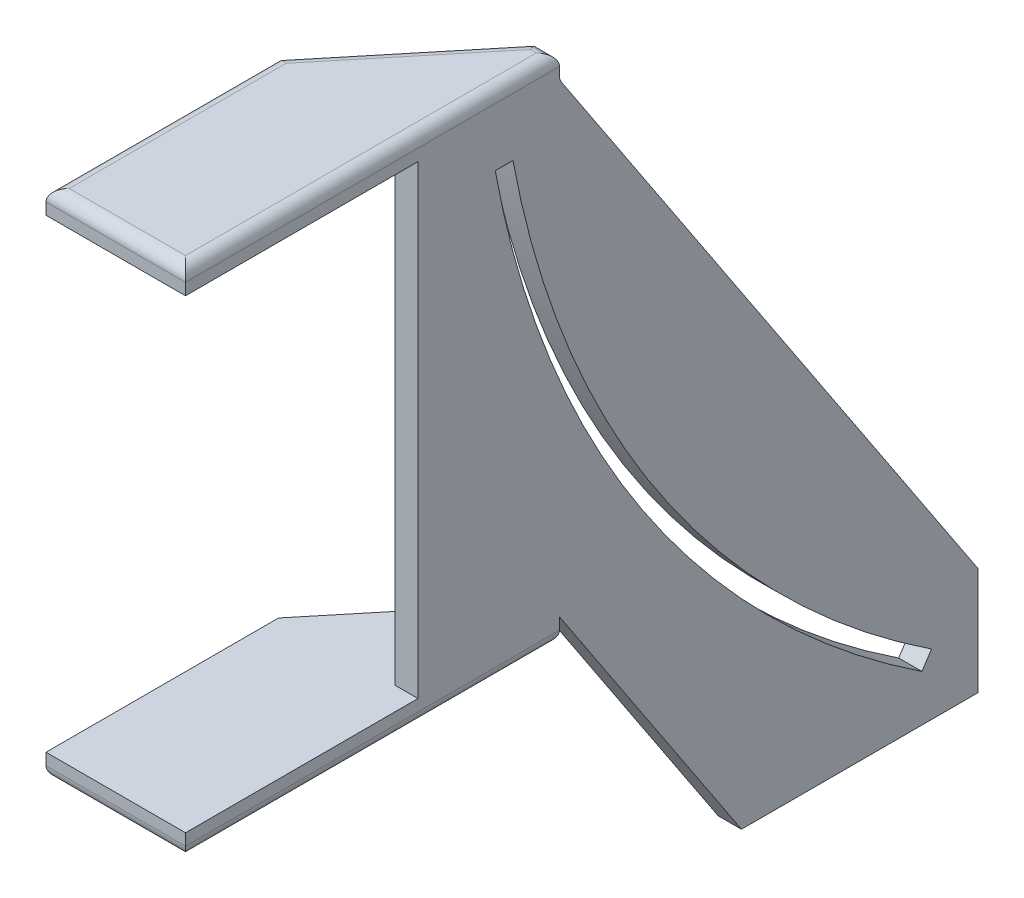
ISO-10303-21;
HEADER;
FILE_DESCRIPTION(('STEP AP214'),'2;1');
FILE_NAME('part.step','',(''),(''),'','','');
FILE_SCHEMA(('AUTOMOTIVE_DESIGN { 1 0 10303 214 1 1 1 1 }'));
ENDSEC;
DATA;
#1=APPLICATION_CONTEXT('core data for automotive mechanical design processes');
#2=APPLICATION_PROTOCOL_DEFINITION('international standard','automotive_design',2000,#1);
#3=PRODUCT_CONTEXT('',#1,'mechanical');
#4=PRODUCT('Part','Part','',(#3));
#5=PRODUCT_RELATED_PRODUCT_CATEGORY('part','',(#4));
#6=PRODUCT_DEFINITION_FORMATION('','',#4);
#7=PRODUCT_DEFINITION_CONTEXT('part definition',#1,'design');
#8=PRODUCT_DEFINITION('design','',#6,#7);
#9=PRODUCT_DEFINITION_SHAPE('','',#8);
#10=(LENGTH_UNIT() NAMED_UNIT(*) SI_UNIT(.MILLI.,.METRE.));
#11=(NAMED_UNIT(*) PLANE_ANGLE_UNIT() SI_UNIT($,.RADIAN.));
#12=(NAMED_UNIT(*) SI_UNIT($,.STERADIAN.) SOLID_ANGLE_UNIT());
#13=UNCERTAINTY_MEASURE_WITH_UNIT(LENGTH_MEASURE(1.E-05),#10,'distance_accuracy_value','');
#14=(GEOMETRIC_REPRESENTATION_CONTEXT(3) GLOBAL_UNCERTAINTY_ASSIGNED_CONTEXT((#13)) GLOBAL_UNIT_ASSIGNED_CONTEXT((#10,
#11,#12)) REPRESENTATION_CONTEXT('',''));
#15=CARTESIAN_POINT('',(0.,0.,0.));
#16=DIRECTION('',(0.,0.,1.));
#17=DIRECTION('',(1.,0.,0.));
#18=AXIS2_PLACEMENT_3D('',#15,#16,#17);
#19=CARTESIAN_POINT('',(3.175,0.,0.));
#20=DIRECTION('',(1.,0.,0.));
#21=DIRECTION('',(0.,0.,-1.));
#22=AXIS2_PLACEMENT_3D('',#19,#20,#21);
#23=PLANE('',#22);
#24=DIRECTION('',(0.,1.,0.));
#25=VECTOR('',#24,1.);
#26=CARTESIAN_POINT('',(3.17499999999999,-84.201,174.625));
#27=LINE('',#26,#25);
#28=CARTESIAN_POINT('',(3.17499999999999,-82.6135,174.625));
#29=VERTEX_POINT('',#28);
#30=CARTESIAN_POINT('',(3.17499999999999,-81.026,174.625));
#31=VERTEX_POINT('',#30);
#32=EDGE_CURVE('E209',#29,#31,#27,.T.);
#33=ORIENTED_EDGE('',*,*,#32,.F.);
#34=DIRECTION('',(0.,0.,1.));
#35=VECTOR('',#34,1.);
#36=CARTESIAN_POINT('',(3.175,-82.6135,0.));
#37=LINE('',#36,#35);
#38=CARTESIAN_POINT('',(3.175,-82.6135,123.554053146928));
#39=VERTEX_POINT('',#38);
#40=EDGE_CURVE('E41',#29,#39,#37,.F.);
#41=ORIENTED_EDGE('',*,*,#40,.T.);
#42=DIRECTION('',(0.,1.,0.));
#43=VECTOR('',#42,1.);
#44=CARTESIAN_POINT('',(3.175,-84.201,123.554053146928));
#45=LINE('',#44,#43);
#46=CARTESIAN_POINT('',(3.175,-81.026,123.554053146928));
#47=VERTEX_POINT('',#46);
#48=EDGE_CURVE('E200',#39,#47,#45,.T.);
#49=ORIENTED_EDGE('',*,*,#48,.T.);
#50=DIRECTION('',(0.,-0.833932185113221,-0.55186693199746));
#51=VECTOR('',#50,1.);
#52=CARTESIAN_POINT('',(3.175,-81.026,123.554053146928));
#53=LINE('',#52,#51);
#54=CARTESIAN_POINT('',(3.175,-118.573420749169,98.7064932815561));
#55=VERTEX_POINT('',#54);
#56=EDGE_CURVE('E204',#47,#55,#53,.T.);
#57=ORIENTED_EDGE('',*,*,#56,.T.);
#58=DIRECTION('',(0.,0.,-1.));
#59=VECTOR('',#58,1.);
#60=CARTESIAN_POINT('',(3.175,-118.573420749169,98.7064932815561));
#61=LINE('',#60,#59);
#62=CARTESIAN_POINT('',(3.175,-118.573420749169,66.4040531469284));
#63=VERTEX_POINT('',#62);
#64=EDGE_CURVE('E225',#55,#63,#61,.T.);
#65=ORIENTED_EDGE('',*,*,#64,.T.);
#66=DIRECTION('',(0.,1.,0.));
#67=VECTOR('',#66,1.);
#68=CARTESIAN_POINT('',(3.175,-103.885992990919,66.4040531469284));
#69=LINE('',#68,#67);
#70=CARTESIAN_POINT('',(3.175,-103.885992990919,66.4040531469284));
#71=VERTEX_POINT('',#70);
#72=EDGE_CURVE('E228',#63,#71,#69,.T.);
#73=ORIENTED_EDGE('',*,*,#72,.T.);
#74=DIRECTION('',(0.,0.833932185113221,0.55186693199746));
#75=VECTOR('',#74,1.);
#76=CARTESIAN_POINT('',(3.175,-17.526,123.554053146928));
#77=LINE('',#76,#75);
#78=CARTESIAN_POINT('',(3.175,-17.9243782036011,123.290420490796));
#79=VERTEX_POINT('',#78);
#80=EDGE_CURVE('E236',#71,#79,#77,.T.);
#81=ORIENTED_EDGE('',*,*,#80,.T.);
#82=CARTESIAN_POINT('',(3.175,-17.0482894490551,121.966553146928));
#83=DIRECTION('',(1.,0.,0.));
#84=DIRECTION('',(0.,0.,-1.));
#85=AXIS2_PLACEMENT_3D('',#82,#83,#84);
#86=CIRCLE('',#85,1.5875);
#87=CARTESIAN_POINT('',(3.175,-17.0482894490551,123.554053146928));
#88=VERTEX_POINT('',#87);
#89=EDGE_CURVE('E296',#79,#88,#86,.F.);
#90=ORIENTED_EDGE('',*,*,#89,.T.);
#91=DIRECTION('',(0.,-1.,0.));
#92=VECTOR('',#91,1.);
#93=CARTESIAN_POINT('',(3.175,-14.351,123.554053146928));
#94=LINE('',#93,#92);
#95=CARTESIAN_POINT('',(3.175,-15.9385,123.554053146928));
#96=VERTEX_POINT('',#95);
#97=EDGE_CURVE('E381',#96,#88,#94,.T.);
#98=ORIENTED_EDGE('',*,*,#97,.F.);
#99=DIRECTION('',(0.,0.,-1.));
#100=VECTOR('',#99,1.);
#101=CARTESIAN_POINT('',(3.175,-15.9385,174.625));
#102=LINE('',#101,#100);
#103=CARTESIAN_POINT('',(3.17499999999999,-15.9385,174.625));
#104=VERTEX_POINT('',#103);
#105=EDGE_CURVE('E284',#96,#104,#102,.F.);
#106=ORIENTED_EDGE('',*,*,#105,.T.);
#107=DIRECTION('',(0.,-1.,0.));
#108=VECTOR('',#107,1.);
#109=CARTESIAN_POINT('',(3.17499999999999,-14.351,174.625));
#110=LINE('',#109,#108);
#111=CARTESIAN_POINT('',(3.17499999999999,-17.526,174.625));
#112=VERTEX_POINT('',#111);
#113=EDGE_CURVE('E384',#104,#112,#110,.T.);
#114=ORIENTED_EDGE('',*,*,#113,.T.);
#115=DIRECTION('',(0.,0.,-1.));
#116=VECTOR('',#115,1.);
#117=CARTESIAN_POINT('',(3.175,-17.526,123.554053146928));
#118=LINE('',#117,#116);
#119=CARTESIAN_POINT('',(3.175,-17.526,142.875));
#120=VERTEX_POINT('',#119);
#121=EDGE_CURVE('E375',#112,#120,#118,.T.);
#122=ORIENTED_EDGE('',*,*,#121,.T.);
#123=DIRECTION('',(0.,-1.,0.));
#124=VECTOR('',#123,1.);
#125=CARTESIAN_POINT('',(3.175,-17.526,142.875));
#126=LINE('',#125,#124);
#127=CARTESIAN_POINT('',(3.175,-81.026,142.875));
#128=VERTEX_POINT('',#127);
#129=EDGE_CURVE('E226',#120,#128,#126,.T.);
#130=ORIENTED_EDGE('',*,*,#129,.T.);
#131=DIRECTION('',(0.,0.,1.));
#132=VECTOR('',#131,1.);
#133=CARTESIAN_POINT('',(3.175,-81.026,123.554053146928));
#134=LINE('',#133,#132);
#135=EDGE_CURVE('E345',#128,#31,#134,.T.);
#136=ORIENTED_EDGE('',*,*,#135,.T.);
#137=EDGE_LOOP('',(#33,#41,#49,#57,#65,#73,#81,#90,#98,#106,#114,#122,#130,#136));
#138=FACE_BOUND('',#137,.T.);
#139=DIRECTION('',(0.,0.,1.));
#140=VECTOR('',#139,1.);
#141=CARTESIAN_POINT('',(3.175,-23.876,132.324466277263));
#142=LINE('',#141,#140);
#143=CARTESIAN_POINT('',(3.175,-23.876,129.904053146928));
#144=VERTEX_POINT('',#143);
#145=CARTESIAN_POINT('',(3.175,-23.876,132.324466277263));
#146=VERTEX_POINT('',#145);
#147=EDGE_CURVE('E393',#144,#146,#142,.T.);
#148=ORIENTED_EDGE('',*,*,#147,.F.);
#149=CARTESIAN_POINT('',(3.175,0.,0.));
#150=DIRECTION('',(-1.,0.,0.));
#151=DIRECTION('',(0.,0.,-1.));
#152=AXIS2_PLACEMENT_3D('',#149,#150,#151);
#153=CIRCLE('',#152,132.08);
#154=CARTESIAN_POINT('',(3.175,-110.235992990919,72.7540531469284));
#155=VERTEX_POINT('',#154);
#156=EDGE_CURVE('E391',#155,#144,#153,.T.);
#157=ORIENTED_EDGE('',*,*,#156,.F.);
#158=DIRECTION('',(0.,0.834615331548452,-0.550833230973102));
#159=VECTOR('',#158,1.);
#160=CARTESIAN_POINT('',(3.175,-112.223420749169,74.0657247781831));
#161=LINE('',#160,#159);
#162=CARTESIAN_POINT('',(3.175,-112.223420749169,74.0657247781831));
#163=VERTEX_POINT('',#162);
#164=EDGE_CURVE('E399',#163,#155,#161,.T.);
#165=ORIENTED_EDGE('',*,*,#164,.F.);
#166=CARTESIAN_POINT('',(3.175,0.,0.));
#167=DIRECTION('',(1.,0.,0.));
#168=DIRECTION('',(0.,0.,-1.));
#169=AXIS2_PLACEMENT_3D('',#166,#167,#168);
#170=CIRCLE('',#169,134.46125);
#171=EDGE_CURVE('E396',#146,#163,#170,.T.);
#172=ORIENTED_EDGE('',*,*,#171,.F.);
#173=EDGE_LOOP('',(#148,#157,#165,#172));
#174=FACE_BOUND('',#173,.T.);
#175=ADVANCED_FACE('F32',(#138,#174),#23,.T.);
#176=CARTESIAN_POINT('',(0.,0.,0.));
#177=DIRECTION('',(1.,0.,0.));
#178=DIRECTION('',(0.,0.,-1.));
#179=AXIS2_PLACEMENT_3D('',#176,#177,#178);
#180=PLANE('',#179);
#181=DIRECTION('',(0.,-1.,0.));
#182=VECTOR('',#181,1.);
#183=CARTESIAN_POINT('',(0.,-17.526,142.875));
#184=LINE('',#183,#182);
#185=CARTESIAN_POINT('',(0.,-17.526,142.875));
#186=VERTEX_POINT('',#185);
#187=CARTESIAN_POINT('',(0.,-81.026,142.875));
#188=VERTEX_POINT('',#187);
#189=EDGE_CURVE('E240',#186,#188,#184,.T.);
#190=ORIENTED_EDGE('',*,*,#189,.F.);
#191=DIRECTION('',(0.,0.,1.));
#192=VECTOR('',#191,1.);
#193=CARTESIAN_POINT('',(0.,-17.526,142.875));
#194=LINE('',#193,#192);
#195=CARTESIAN_POINT('',(0.,-17.526,123.554053146928));
#196=VERTEX_POINT('',#195);
#197=EDGE_CURVE('E231',#196,#186,#194,.T.);
#198=ORIENTED_EDGE('',*,*,#197,.F.);
#199=DIRECTION('',(0.,1.,0.));
#200=VECTOR('',#199,1.);
#201=CARTESIAN_POINT('',(0.,-14.351,123.554053146928));
#202=LINE('',#201,#200);
#203=CARTESIAN_POINT('',(0.,-17.0482929876395,123.554053146928));
#204=VERTEX_POINT('',#203);
#205=EDGE_CURVE('E298',#196,#204,#202,.T.);
#206=ORIENTED_EDGE('',*,*,#205,.T.);
#207=CARTESIAN_POINT('',(0.,-17.0482894490551,121.966553146928));
#208=DIRECTION('',(1.,0.,0.));
#209=DIRECTION('',(0.,0.,-1.));
#210=AXIS2_PLACEMENT_3D('',#207,#208,#209);
#211=CIRCLE('',#210,1.5875);
#212=CARTESIAN_POINT('',(0.,-17.9243782036011,123.290420490796));
#213=VERTEX_POINT('',#212);
#214=EDGE_CURVE('E294',#204,#213,#211,.T.);
#215=ORIENTED_EDGE('',*,*,#214,.T.);
#216=DIRECTION('',(0.,0.833932185113221,0.55186693199746));
#217=VECTOR('',#216,1.);
#218=CARTESIAN_POINT('',(0.,-17.526,123.554053146928));
#219=LINE('',#218,#217);
#220=CARTESIAN_POINT('',(0.,-103.885992990919,66.4040531469284));
#221=VERTEX_POINT('',#220);
#222=EDGE_CURVE('E253',#221,#213,#219,.T.);
#223=ORIENTED_EDGE('',*,*,#222,.F.);
#224=DIRECTION('',(0.,1.,0.));
#225=VECTOR('',#224,1.);
#226=CARTESIAN_POINT('',(0.,-103.885992990919,66.4040531469284));
#227=LINE('',#226,#225);
#228=CARTESIAN_POINT('',(0.,-118.573420749169,66.4040531469284));
#229=VERTEX_POINT('',#228);
#230=EDGE_CURVE('E251',#229,#221,#227,.T.);
#231=ORIENTED_EDGE('',*,*,#230,.F.);
#232=DIRECTION('',(0.,0.,-1.));
#233=VECTOR('',#232,1.);
#234=CARTESIAN_POINT('',(0.,-118.573420749169,98.7064932815561));
#235=LINE('',#234,#233);
#236=CARTESIAN_POINT('',(0.,-118.573420749169,98.7064932815561));
#237=VERTEX_POINT('',#236);
#238=EDGE_CURVE('E249',#237,#229,#235,.T.);
#239=ORIENTED_EDGE('',*,*,#238,.F.);
#240=DIRECTION('',(0.,-0.833932185113221,-0.55186693199746));
#241=VECTOR('',#240,1.);
#242=CARTESIAN_POINT('',(0.,-81.026,123.554053146928));
#243=LINE('',#242,#241);
#244=CARTESIAN_POINT('',(0.,-81.026,123.554053146928));
#245=VERTEX_POINT('',#244);
#246=EDGE_CURVE('E247',#245,#237,#243,.T.);
#247=ORIENTED_EDGE('',*,*,#246,.F.);
#248=DIRECTION('',(0.,0.,-1.));
#249=VECTOR('',#248,1.);
#250=CARTESIAN_POINT('',(0.,-81.026,142.875));
#251=LINE('',#250,#249);
#252=EDGE_CURVE('E243',#188,#245,#251,.T.);
#253=ORIENTED_EDGE('',*,*,#252,.F.);
#254=EDGE_LOOP('',(#190,#198,#206,#215,#223,#231,#239,#247,#253));
#255=FACE_BOUND('',#254,.T.);
#256=CARTESIAN_POINT('',(0.,0.,0.));
#257=DIRECTION('',(-1.,0.,0.));
#258=DIRECTION('',(0.,0.,-1.));
#259=AXIS2_PLACEMENT_3D('',#256,#257,#258);
#260=CIRCLE('',#259,132.08);
#261=CARTESIAN_POINT('',(0.,-110.235992990919,72.7540531469284));
#262=VERTEX_POINT('',#261);
#263=CARTESIAN_POINT('',(0.,-23.876,129.904053146928));
#264=VERTEX_POINT('',#263);
#265=EDGE_CURVE('E390',#262,#264,#260,.T.);
#266=ORIENTED_EDGE('',*,*,#265,.T.);
#267=DIRECTION('',(0.,0.,1.));
#268=VECTOR('',#267,1.);
#269=CARTESIAN_POINT('',(0.,-23.876,132.324466277263));
#270=LINE('',#269,#268);
#271=CARTESIAN_POINT('',(0.,-23.876,132.324466277263));
#272=VERTEX_POINT('',#271);
#273=EDGE_CURVE('E404',#264,#272,#270,.T.);
#274=ORIENTED_EDGE('',*,*,#273,.T.);
#275=CARTESIAN_POINT('',(0.,0.,0.));
#276=DIRECTION('',(1.,0.,0.));
#277=DIRECTION('',(0.,0.,-1.));
#278=AXIS2_PLACEMENT_3D('',#275,#276,#277);
#279=CIRCLE('',#278,134.46125);
#280=CARTESIAN_POINT('',(0.,-112.223420749169,74.0657247781831));
#281=VERTEX_POINT('',#280);
#282=EDGE_CURVE('E407',#272,#281,#279,.T.);
#283=ORIENTED_EDGE('',*,*,#282,.T.);
#284=DIRECTION('',(0.,0.834615331548452,-0.550833230973102));
#285=VECTOR('',#284,1.);
#286=CARTESIAN_POINT('',(0.,-112.223420749169,74.0657247781831));
#287=LINE('',#286,#285);
#288=EDGE_CURVE('E394',#281,#262,#287,.T.);
#289=ORIENTED_EDGE('',*,*,#288,.T.);
#290=EDGE_LOOP('',(#266,#274,#283,#289));
#291=FACE_BOUND('',#290,.T.);
#292=ADVANCED_FACE('F426',(#255,#291),#180,.F.);
#293=CARTESIAN_POINT('',(3.175,-17.526,142.875));
#294=DIRECTION('',(0.,0.,-1.));
#295=DIRECTION('',(-1.,0.,0.));
#296=AXIS2_PLACEMENT_3D('',#293,#294,#295);
#297=PLANE('',#296);
#298=ORIENTED_EDGE('',*,*,#189,.T.);
#299=DIRECTION('',(-1.,0.,0.));
#300=VECTOR('',#299,1.);
#301=CARTESIAN_POINT('',(3.175,-81.026,142.875));
#302=LINE('',#301,#300);
#303=EDGE_CURVE('E219',#128,#188,#302,.T.);
#304=ORIENTED_EDGE('',*,*,#303,.F.);
#305=ORIENTED_EDGE('',*,*,#129,.F.);
#306=DIRECTION('',(-1.,0.,0.));
#307=VECTOR('',#306,1.);
#308=CARTESIAN_POINT('',(3.175,-17.526,142.875));
#309=LINE('',#308,#307);
#310=EDGE_CURVE('E239',#120,#186,#309,.T.);
#311=ORIENTED_EDGE('',*,*,#310,.T.);
#312=EDGE_LOOP('',(#298,#304,#305,#311));
#313=FACE_BOUND('',#312,.T.);
#314=ADVANCED_FACE('F451',(#313),#297,.F.);
#315=CARTESIAN_POINT('',(3.175,-81.026,123.554053146928));
#316=DIRECTION('',(0.,0.55186693199746,-0.833932185113221));
#317=DIRECTION('',(0.,0.833932185113221,0.55186693199746));
#318=AXIS2_PLACEMENT_3D('',#315,#316,#317);
#319=PLANE('',#318);
#320=ORIENTED_EDGE('',*,*,#246,.T.);
#321=DIRECTION('',(-1.,0.,0.));
#322=VECTOR('',#321,1.);
#323=CARTESIAN_POINT('',(3.175,-118.573420749169,98.7064932815561));
#324=LINE('',#323,#322);
#325=EDGE_CURVE('E220',#55,#237,#324,.T.);
#326=ORIENTED_EDGE('',*,*,#325,.F.);
#327=ORIENTED_EDGE('',*,*,#56,.F.);
#328=DIRECTION('',(-1.,0.,0.));
#329=VECTOR('',#328,1.);
#330=CARTESIAN_POINT('',(3.175,-81.026,123.554053146928));
#331=LINE('',#330,#329);
#332=EDGE_CURVE('E212',#47,#245,#331,.T.);
#333=ORIENTED_EDGE('',*,*,#332,.T.);
#334=EDGE_LOOP('',(#320,#326,#327,#333));
#335=FACE_BOUND('',#334,.T.);
#336=ADVANCED_FACE('F222',(#335),#319,.F.);
#337=CARTESIAN_POINT('',(3.175,-118.573420749169,98.7064932815561));
#338=DIRECTION('',(0.,1.,0.));
#339=DIRECTION('',(0.,0.,1.));
#340=AXIS2_PLACEMENT_3D('',#337,#338,#339);
#341=PLANE('',#340);
#342=ORIENTED_EDGE('',*,*,#238,.T.);
#343=DIRECTION('',(-1.,0.,0.));
#344=VECTOR('',#343,1.);
#345=CARTESIAN_POINT('',(3.175,-118.573420749169,66.4040531469284));
#346=LINE('',#345,#344);
#347=EDGE_CURVE('E262',#63,#229,#346,.T.);
#348=ORIENTED_EDGE('',*,*,#347,.F.);
#349=ORIENTED_EDGE('',*,*,#64,.F.);
#350=ORIENTED_EDGE('',*,*,#325,.T.);
#351=EDGE_LOOP('',(#342,#348,#349,#350));
#352=FACE_BOUND('',#351,.T.);
#353=ADVANCED_FACE('F463',(#352),#341,.F.);
#354=CARTESIAN_POINT('',(3.175,-103.885992990919,66.4040531469284));
#355=DIRECTION('',(0.,0.,1.));
#356=DIRECTION('',(1.,0.,0.));
#357=AXIS2_PLACEMENT_3D('',#354,#355,#356);
#358=PLANE('',#357);
#359=ORIENTED_EDGE('',*,*,#230,.T.);
#360=DIRECTION('',(-1.,0.,0.));
#361=VECTOR('',#360,1.);
#362=CARTESIAN_POINT('',(3.175,-103.885992990919,66.4040531469284));
#363=LINE('',#362,#361);
#364=EDGE_CURVE('E259',#71,#221,#363,.T.);
#365=ORIENTED_EDGE('',*,*,#364,.F.);
#366=ORIENTED_EDGE('',*,*,#72,.F.);
#367=ORIENTED_EDGE('',*,*,#347,.T.);
#368=EDGE_LOOP('',(#359,#365,#366,#367));
#369=FACE_BOUND('',#368,.T.);
#370=ADVANCED_FACE('F459',(#369),#358,.F.);
#371=CARTESIAN_POINT('',(3.175,-17.526,123.554053146928));
#372=DIRECTION('',(0.,-0.55186693199746,0.83393218511322));
#373=DIRECTION('',(0.,-0.833932185113221,-0.55186693199746));
#374=AXIS2_PLACEMENT_3D('',#371,#372,#373);
#375=PLANE('',#374);
#376=ORIENTED_EDGE('',*,*,#222,.T.);
#377=DIRECTION('',(-1.,0.,0.));
#378=VECTOR('',#377,1.);
#379=CARTESIAN_POINT('',(3.175,-17.9243782036011,123.290420490796));
#380=LINE('',#379,#378);
#381=EDGE_CURVE('E292',#213,#79,#380,.F.);
#382=ORIENTED_EDGE('',*,*,#381,.T.);
#383=ORIENTED_EDGE('',*,*,#80,.F.);
#384=ORIENTED_EDGE('',*,*,#364,.T.);
#385=EDGE_LOOP('',(#376,#382,#383,#384));
#386=FACE_BOUND('',#385,.T.);
#387=ADVANCED_FACE('F456',(#386),#375,.F.);
#388=CARTESIAN_POINT('',(3.175,0.,0.));
#389=DIRECTION('',(-1.,0.,0.));
#390=DIRECTION('',(0.,0.,1.));
#391=AXIS2_PLACEMENT_3D('',#388,#389,#390);
#392=CYLINDRICAL_SURFACE('',#391,132.08);
#393=ORIENTED_EDGE('',*,*,#265,.F.);
#394=DIRECTION('',(-1.,0.,0.));
#395=VECTOR('',#394,1.);
#396=CARTESIAN_POINT('',(3.175,-110.235992990919,72.7540531469284));
#397=LINE('',#396,#395);
#398=EDGE_CURVE('E401',#155,#262,#397,.T.);
#399=ORIENTED_EDGE('',*,*,#398,.F.);
#400=ORIENTED_EDGE('',*,*,#156,.T.);
#401=DIRECTION('',(-1.,0.,0.));
#402=VECTOR('',#401,1.);
#403=CARTESIAN_POINT('',(3.175,-23.876,129.904053146928));
#404=LINE('',#403,#402);
#405=EDGE_CURVE('E244',#144,#264,#404,.T.);
#406=ORIENTED_EDGE('',*,*,#405,.T.);
#407=EDGE_LOOP('',(#393,#399,#400,#406));
#408=FACE_BOUND('',#407,.T.);
#409=ADVANCED_FACE('F420',(#408),#392,.T.);
#410=CARTESIAN_POINT('',(3.175,-23.876,132.324466277263));
#411=DIRECTION('',(0.,-1.,0.));
#412=DIRECTION('',(0.,0.,-1.));
#413=AXIS2_PLACEMENT_3D('',#410,#411,#412);
#414=PLANE('',#413);
#415=ORIENTED_EDGE('',*,*,#273,.F.);
#416=ORIENTED_EDGE('',*,*,#405,.F.);
#417=ORIENTED_EDGE('',*,*,#147,.T.);
#418=DIRECTION('',(-1.,0.,0.));
#419=VECTOR('',#418,1.);
#420=CARTESIAN_POINT('',(3.175,-23.876,132.324466277263));
#421=LINE('',#420,#419);
#422=EDGE_CURVE('E416',#146,#272,#421,.T.);
#423=ORIENTED_EDGE('',*,*,#422,.T.);
#424=EDGE_LOOP('',(#415,#416,#417,#423));
#425=FACE_BOUND('',#424,.T.);
#426=ADVANCED_FACE('F434',(#425),#414,.T.);
#427=CARTESIAN_POINT('',(3.175,0.,0.));
#428=DIRECTION('',(-1.,0.,0.));
#429=DIRECTION('',(0.,0.,1.));
#430=AXIS2_PLACEMENT_3D('',#427,#428,#429);
#431=CYLINDRICAL_SURFACE('',#430,134.46125);
#432=ORIENTED_EDGE('',*,*,#282,.F.);
#433=ORIENTED_EDGE('',*,*,#422,.F.);
#434=ORIENTED_EDGE('',*,*,#171,.T.);
#435=DIRECTION('',(-1.,0.,0.));
#436=VECTOR('',#435,1.);
#437=CARTESIAN_POINT('',(3.175,-112.223420749169,74.0657247781831));
#438=LINE('',#437,#436);
#439=EDGE_CURVE('E414',#163,#281,#438,.T.);
#440=ORIENTED_EDGE('',*,*,#439,.T.);
#441=EDGE_LOOP('',(#432,#433,#434,#440));
#442=FACE_BOUND('',#441,.T.);
#443=ADVANCED_FACE('F436',(#442),#431,.F.);
#444=CARTESIAN_POINT('',(3.175,-112.223420749169,74.0657247781831));
#445=DIRECTION('',(0.,0.550833230973102,0.834615331548452));
#446=DIRECTION('',(0.,-0.834615331548452,0.550833230973102));
#447=AXIS2_PLACEMENT_3D('',#444,#445,#446);
#448=PLANE('',#447);
#449=ORIENTED_EDGE('',*,*,#288,.F.);
#450=ORIENTED_EDGE('',*,*,#439,.F.);
#451=ORIENTED_EDGE('',*,*,#164,.T.);
#452=ORIENTED_EDGE('',*,*,#398,.T.);
#453=EDGE_LOOP('',(#449,#450,#451,#452));
#454=FACE_BOUND('',#453,.T.);
#455=ADVANCED_FACE('F430',(#454),#448,.T.);
#456=CARTESIAN_POINT('',(0.,-14.351,123.554053146928));
#457=DIRECTION('',(0.772643432088012,0.,0.634840237265454));
#458=DIRECTION('',(0.634840237265454,0.,-0.772643432088012));
#459=AXIS2_PLACEMENT_3D('',#456,#457,#458);
#460=PLANE('',#459);
#461=DIRECTION('',(0.,-1.,0.));
#462=VECTOR('',#461,1.);
#463=CARTESIAN_POINT('',(-15.875,-14.351,142.875));
#464=LINE('',#463,#462);
#465=CARTESIAN_POINT('',(-15.875,-15.9385,142.875));
#466=VERTEX_POINT('',#465);
#467=CARTESIAN_POINT('',(-15.875,-17.526,142.875));
#468=VERTEX_POINT('',#467);
#469=EDGE_CURVE('E388',#466,#468,#464,.T.);
#470=ORIENTED_EDGE('',*,*,#469,.F.);
#471=DIRECTION('',(-0.634840237265454,0.,0.772643432088012));
#472=VECTOR('',#471,1.);
#473=CARTESIAN_POINT('',(0.,-15.9385,123.554053146928));
#474=LINE('',#473,#472);
#475=CARTESIAN_POINT('',(0.,-15.9385,123.554053146928));
#476=VERTEX_POINT('',#475);
#477=EDGE_CURVE('E290',#466,#476,#474,.F.);
#478=ORIENTED_EDGE('',*,*,#477,.T.);
#479=DIRECTION('',(0.,-1.,0.));
#480=VECTOR('',#479,1.);
#481=CARTESIAN_POINT('',(0.,-14.351,123.554053146928));
#482=LINE('',#481,#480);
#483=EDGE_CURVE('E378',#476,#204,#482,.T.);
#484=ORIENTED_EDGE('',*,*,#483,.T.);
#485=ORIENTED_EDGE('',*,*,#205,.F.);
#486=DIRECTION('',(-0.634840237265454,0.,0.772643432088012));
#487=VECTOR('',#486,1.);
#488=CARTESIAN_POINT('',(0.,-17.526,123.554053146928));
#489=LINE('',#488,#487);
#490=EDGE_CURVE('E314',#196,#468,#489,.T.);
#491=ORIENTED_EDGE('',*,*,#490,.T.);
#492=EDGE_LOOP('',(#470,#478,#484,#485,#491));
#493=FACE_BOUND('',#492,.T.);
#494=ADVANCED_FACE('F443',(#493),#460,.F.);
#495=CARTESIAN_POINT('',(-15.875,-14.351,142.875));
#496=DIRECTION('',(1.,0.,0.));
#497=DIRECTION('',(0.,0.,-1.));
#498=AXIS2_PLACEMENT_3D('',#495,#496,#497);
#499=PLANE('',#498);
#500=DIRECTION('',(0.,-1.,0.));
#501=VECTOR('',#500,1.);
#502=CARTESIAN_POINT('',(-15.875,-14.351,174.625));
#503=LINE('',#502,#501);
#504=CARTESIAN_POINT('',(-15.875,-15.9385,174.625));
#505=VERTEX_POINT('',#504);
#506=CARTESIAN_POINT('',(-15.875,-17.526,174.625));
#507=VERTEX_POINT('',#506);
#508=EDGE_CURVE('E386',#505,#507,#503,.T.);
#509=ORIENTED_EDGE('',*,*,#508,.F.);
#510=DIRECTION('',(0.,0.,1.));
#511=VECTOR('',#510,1.);
#512=CARTESIAN_POINT('',(-15.875,-15.9385,142.875));
#513=LINE('',#512,#511);
#514=EDGE_CURVE('E288',#505,#466,#513,.F.);
#515=ORIENTED_EDGE('',*,*,#514,.T.);
#516=ORIENTED_EDGE('',*,*,#469,.T.);
#517=DIRECTION('',(0.,0.,1.));
#518=VECTOR('',#517,1.);
#519=CARTESIAN_POINT('',(-15.875,-17.526,142.875));
#520=LINE('',#519,#518);
#521=EDGE_CURVE('E369',#468,#507,#520,.T.);
#522=ORIENTED_EDGE('',*,*,#521,.T.);
#523=EDGE_LOOP('',(#509,#515,#516,#522));
#524=FACE_BOUND('',#523,.T.);
#525=ADVANCED_FACE('F585',(#524),#499,.F.);
#526=CARTESIAN_POINT('',(3.17499999999999,-14.351,174.625));
#527=DIRECTION('',(0.,0.,-1.));
#528=DIRECTION('',(-1.,0.,0.));
#529=AXIS2_PLACEMENT_3D('',#526,#527,#528);
#530=PLANE('',#529);
#531=ORIENTED_EDGE('',*,*,#113,.F.);
#532=DIRECTION('',(1.,0.,0.));
#533=VECTOR('',#532,1.);
#534=CARTESIAN_POINT('',(3.17499999999999,-15.9385,174.625));
#535=LINE('',#534,#533);
#536=EDGE_CURVE('E286',#104,#505,#535,.F.);
#537=ORIENTED_EDGE('',*,*,#536,.T.);
#538=ORIENTED_EDGE('',*,*,#508,.T.);
#539=DIRECTION('',(1.,0.,0.));
#540=VECTOR('',#539,1.);
#541=CARTESIAN_POINT('',(3.17499999999999,-17.526,174.625));
#542=LINE('',#541,#540);
#543=EDGE_CURVE('E372',#507,#112,#542,.T.);
#544=ORIENTED_EDGE('',*,*,#543,.T.);
#545=EDGE_LOOP('',(#531,#537,#538,#544));
#546=FACE_BOUND('',#545,.T.);
#547=ADVANCED_FACE('F552',(#546),#530,.F.);
#548=CARTESIAN_POINT('',(0.,-14.351,123.554053146928));
#549=DIRECTION('',(0.,0.,1.));
#550=DIRECTION('',(1.,0.,0.));
#551=AXIS2_PLACEMENT_3D('',#548,#549,#550);
#552=PLANE('',#551);
#553=ORIENTED_EDGE('',*,*,#483,.F.);
#554=DIRECTION('',(-1.,0.,0.));
#555=VECTOR('',#554,1.);
#556=CARTESIAN_POINT('',(0.,-15.9385,123.554053146928));
#557=LINE('',#556,#555);
#558=EDGE_CURVE('E281',#476,#96,#557,.F.);
#559=ORIENTED_EDGE('',*,*,#558,.T.);
#560=ORIENTED_EDGE('',*,*,#97,.T.);
#561=DIRECTION('',(-1.,0.,0.));
#562=VECTOR('',#561,1.);
#563=CARTESIAN_POINT('',(0.,-17.0482894490551,123.554053146928));
#564=LINE('',#563,#562);
#565=EDGE_CURVE('E278',#88,#204,#564,.T.);
#566=ORIENTED_EDGE('',*,*,#565,.T.);
#567=EDGE_LOOP('',(#553,#559,#560,#566));
#568=FACE_BOUND('',#567,.T.);
#569=ADVANCED_FACE('F563',(#568),#552,.F.);
#570=CARTESIAN_POINT('',(0.,-14.351,0.));
#571=DIRECTION('',(0.,-1.,0.));
#572=DIRECTION('',(0.,0.,-1.));
#573=AXIS2_PLACEMENT_3D('',#570,#571,#572);
#574=PLANE('',#573);
#575=DIRECTION('',(0.,0.,-1.));
#576=VECTOR('',#575,1.);
#577=CARTESIAN_POINT('',(1.5875,-14.351,123.554053146928));
#578=LINE('',#577,#576);
#579=CARTESIAN_POINT('',(1.5875,-14.351,173.0375));
#580=VERTEX_POINT('',#579);
#581=CARTESIAN_POINT('',(1.5875,-14.351,125.141553146928));
#582=VERTEX_POINT('',#581);
#583=EDGE_CURVE('E273',#580,#582,#578,.T.);
#584=ORIENTED_EDGE('',*,*,#583,.T.);
#585=DIRECTION('',(-1.,0.,0.));
#586=VECTOR('',#585,1.);
#587=CARTESIAN_POINT('',(0.,-14.351,125.141553146928));
#588=LINE('',#587,#586);
#589=CARTESIAN_POINT('',(0.75026991658305,-14.351,125.141553146928));
#590=VERTEX_POINT('',#589);
#591=EDGE_CURVE('E275',#582,#590,#588,.T.);
#592=ORIENTED_EDGE('',*,*,#591,.T.);
#593=DIRECTION('',(-0.634840237265454,0.,0.772643432088012));
#594=VECTOR('',#593,1.);
#595=CARTESIAN_POINT('',(61.8304695537487,-14.351,50.8028261570273));
#596=LINE('',#595,#594);
#597=CARTESIAN_POINT('',(-14.2875,-14.351,143.443534460127));
#598=VERTEX_POINT('',#597);
#599=EDGE_CURVE('E267',#590,#598,#596,.T.);
#600=ORIENTED_EDGE('',*,*,#599,.T.);
#601=DIRECTION('',(0.,0.,1.));
#602=VECTOR('',#601,1.);
#603=CARTESIAN_POINT('',(-14.2875,-14.351,0.));
#604=LINE('',#603,#602);
#605=CARTESIAN_POINT('',(-14.2875,-14.351,173.0375));
#606=VERTEX_POINT('',#605);
#607=EDGE_CURVE('E269',#598,#606,#604,.T.);
#608=ORIENTED_EDGE('',*,*,#607,.T.);
#609=DIRECTION('',(1.,0.,0.));
#610=VECTOR('',#609,1.);
#611=CARTESIAN_POINT('',(0.,-14.351,173.0375));
#612=LINE('',#611,#610);
#613=EDGE_CURVE('E271',#606,#580,#612,.T.);
#614=ORIENTED_EDGE('',*,*,#613,.T.);
#615=EDGE_LOOP('',(#584,#592,#600,#608,#614));
#616=FACE_BOUND('',#615,.T.);
#617=ADVANCED_FACE('F579',(#616),#574,.F.);
#618=CARTESIAN_POINT('',(0.,-17.526,0.));
#619=DIRECTION('',(0.,-1.,0.));
#620=DIRECTION('',(0.,0.,-1.));
#621=AXIS2_PLACEMENT_3D('',#618,#619,#620);
#622=PLANE('',#621);
#623=ORIENTED_EDGE('',*,*,#490,.F.);
#624=ORIENTED_EDGE('',*,*,#197,.T.);
#625=ORIENTED_EDGE('',*,*,#310,.F.);
#626=ORIENTED_EDGE('',*,*,#121,.F.);
#627=ORIENTED_EDGE('',*,*,#543,.F.);
#628=ORIENTED_EDGE('',*,*,#521,.F.);
#629=EDGE_LOOP('',(#623,#624,#625,#626,#627,#628));
#630=FACE_BOUND('',#629,.T.);
#631=ADVANCED_FACE('F493',(#630),#622,.T.);
#632=CARTESIAN_POINT('',(0.,-15.9385,173.0375));
#633=DIRECTION('',(1.,0.,0.));
#634=DIRECTION('',(0.,0.,-1.));
#635=AXIS2_PLACEMENT_3D('',#632,#633,#634);
#636=CYLINDRICAL_SURFACE('',#635,1.5875);
#637=CARTESIAN_POINT('',(1.5875,-15.9385,173.0375));
#638=DIRECTION('',(0.707106781186547,0.,-0.707106781186547));
#639=DIRECTION('',(0.707106781186547,0.,0.707106781186547));
#640=AXIS2_PLACEMENT_3D('',#637,#638,#639);
#641=ELLIPSE('',#640,2.24506403026729,1.5875);
#642=EDGE_CURVE('E308',#580,#104,#641,.T.);
#643=ORIENTED_EDGE('',*,*,#642,.F.);
#644=ORIENTED_EDGE('',*,*,#613,.F.);
#645=CARTESIAN_POINT('',(-14.2875,-15.9385,173.0375));
#646=DIRECTION('',(0.707106781186547,0.,0.707106781186548));
#647=DIRECTION('',(-0.707106781186547,0.,0.707106781186547));
#648=AXIS2_PLACEMENT_3D('',#645,#646,#647);
#649=ELLIPSE('',#648,2.24506403026729,1.5875);
#650=EDGE_CURVE('E311',#505,#606,#649,.F.);
#651=ORIENTED_EDGE('',*,*,#650,.F.);
#652=ORIENTED_EDGE('',*,*,#536,.F.);
#653=EDGE_LOOP('',(#643,#644,#651,#652));
#654=FACE_BOUND('',#653,.T.);
#655=ADVANCED_FACE('F489',(#654),#636,.T.);
#656=CARTESIAN_POINT('',(-14.2875,-15.9385,0.));
#657=DIRECTION('',(0.,0.,1.));
#658=DIRECTION('',(1.,0.,0.));
#659=AXIS2_PLACEMENT_3D('',#656,#657,#658);
#660=CYLINDRICAL_SURFACE('',#659,1.5875);
#661=ORIENTED_EDGE('',*,*,#650,.T.);
#662=ORIENTED_EDGE('',*,*,#607,.F.);
#663=CARTESIAN_POINT('',(-14.2875,-15.9385,143.443534460127));
#664=DIRECTION('',(-0.337162103380546,0.,0.941446608174891));
#665=DIRECTION('',(-0.941446608174891,0.,-0.337162103380546));
#666=AXIS2_PLACEMENT_3D('',#663,#664,#665);
#667=ELLIPSE('',#666,1.68623476489821,1.5875);
#668=EDGE_CURVE('E305',#466,#598,#667,.F.);
#669=ORIENTED_EDGE('',*,*,#668,.F.);
#670=ORIENTED_EDGE('',*,*,#514,.F.);
#671=EDGE_LOOP('',(#661,#662,#669,#670));
#672=FACE_BOUND('',#671,.T.);
#673=ADVANCED_FACE('F485',(#672),#660,.T.);
#674=CARTESIAN_POINT('',(1.5875,-15.9385,0.));
#675=DIRECTION('',(0.,0.,1.));
#676=DIRECTION('',(1.,0.,0.));
#677=AXIS2_PLACEMENT_3D('',#674,#675,#676);
#678=CYLINDRICAL_SURFACE('',#677,1.5875);
#679=ORIENTED_EDGE('',*,*,#642,.T.);
#680=ORIENTED_EDGE('',*,*,#105,.F.);
#681=CARTESIAN_POINT('',(1.5875,-15.9385,125.141553146928));
#682=DIRECTION('',(0.707106781186547,0.,0.707106781186547));
#683=DIRECTION('',(-0.707106781186547,0.,0.707106781186547));
#684=AXIS2_PLACEMENT_3D('',#681,#682,#683);
#685=ELLIPSE('',#684,2.24506403026729,1.5875);
#686=EDGE_CURVE('E303',#582,#96,#685,.F.);
#687=ORIENTED_EDGE('',*,*,#686,.F.);
#688=ORIENTED_EDGE('',*,*,#583,.F.);
#689=EDGE_LOOP('',(#679,#680,#687,#688));
#690=FACE_BOUND('',#689,.T.);
#691=ADVANCED_FACE('F481',(#690),#678,.T.);
#692=CARTESIAN_POINT('',(61.8304695537487,-15.9385,50.8028261570273));
#693=DIRECTION('',(-0.634840237265454,0.,0.772643432088012));
#694=DIRECTION('',(0.772643432088012,0.,0.634840237265454));
#695=AXIS2_PLACEMENT_3D('',#692,#693,#694);
#696=CYLINDRICAL_SURFACE('',#695,1.5875);
#697=ORIENTED_EDGE('',*,*,#668,.T.);
#698=ORIENTED_EDGE('',*,*,#599,.F.);
#699=CARTESIAN_POINT('',(0.750269916583036,-15.9385,125.141553146928));
#700=DIRECTION('',(-0.904112890425044,0.,0.427293671106036));
#701=DIRECTION('',(0.427293671106036,0.,0.904112890425044));
#702=AXIS2_PLACEMENT_3D('',#699,#700,#701);
#703=ELLIPSE('',#702,1.75586480052694,1.5875);
#704=EDGE_CURVE('E208',#476,#590,#703,.F.);
#705=ORIENTED_EDGE('',*,*,#704,.F.);
#706=ORIENTED_EDGE('',*,*,#477,.F.);
#707=EDGE_LOOP('',(#697,#698,#705,#706));
#708=FACE_BOUND('',#707,.T.);
#709=ADVANCED_FACE('F477',(#708),#696,.T.);
#710=CARTESIAN_POINT('',(0.,-15.9385,125.141553146928));
#711=DIRECTION('',(-1.,0.,0.));
#712=DIRECTION('',(0.,0.,1.));
#713=AXIS2_PLACEMENT_3D('',#710,#711,#712);
#714=CYLINDRICAL_SURFACE('',#713,1.5875);
#715=ORIENTED_EDGE('',*,*,#686,.T.);
#716=ORIENTED_EDGE('',*,*,#558,.F.);
#717=ORIENTED_EDGE('',*,*,#704,.T.);
#718=ORIENTED_EDGE('',*,*,#591,.F.);
#719=EDGE_LOOP('',(#715,#716,#717,#718));
#720=FACE_BOUND('',#719,.T.);
#721=ADVANCED_FACE('F473',(#720),#714,.T.);
#722=CARTESIAN_POINT('',(0.,-17.0482894490551,121.966553146928));
#723=DIRECTION('',(1.,0.,0.));
#724=DIRECTION('',(0.,0.,-1.));
#725=AXIS2_PLACEMENT_3D('',#722,#723,#724);
#726=CYLINDRICAL_SURFACE('',#725,1.5875);
#727=ORIENTED_EDGE('',*,*,#89,.F.);
#728=ORIENTED_EDGE('',*,*,#381,.F.);
#729=ORIENTED_EDGE('',*,*,#214,.F.);
#730=ORIENTED_EDGE('',*,*,#565,.F.);
#731=EDGE_LOOP('',(#727,#728,#729,#730));
#732=FACE_BOUND('',#731,.T.);
#733=ADVANCED_FACE('F476',(#732),#726,.F.);
#734=CARTESIAN_POINT('',(0.,-81.026,0.));
#735=DIRECTION('',(0.,-1.,0.));
#736=DIRECTION('',(0.,0.,-1.));
#737=AXIS2_PLACEMENT_3D('',#734,#735,#736);
#738=PLANE('',#737);
#739=ORIENTED_EDGE('',*,*,#303,.T.);
#740=ORIENTED_EDGE('',*,*,#252,.T.);
#741=DIRECTION('',(0.634840237265454,0.,-0.772643432088012));
#742=VECTOR('',#741,1.);
#743=CARTESIAN_POINT('',(-15.875,-81.026,142.875));
#744=LINE('',#743,#742);
#745=CARTESIAN_POINT('',(-15.875,-81.026,142.875));
#746=VERTEX_POINT('',#745);
#747=EDGE_CURVE('E359',#746,#245,#744,.T.);
#748=ORIENTED_EDGE('',*,*,#747,.F.);
#749=DIRECTION('',(0.,0.,-1.));
#750=VECTOR('',#749,1.);
#751=CARTESIAN_POINT('',(-15.875,-81.026,174.625));
#752=LINE('',#751,#750);
#753=CARTESIAN_POINT('',(-15.875,-81.026,174.625));
#754=VERTEX_POINT('',#753);
#755=EDGE_CURVE('E354',#754,#746,#752,.T.);
#756=ORIENTED_EDGE('',*,*,#755,.F.);
#757=DIRECTION('',(-1.,0.,0.));
#758=VECTOR('',#757,1.);
#759=CARTESIAN_POINT('',(3.17499999999999,-81.026,174.625));
#760=LINE('',#759,#758);
#761=EDGE_CURVE('E350',#31,#754,#760,.T.);
#762=ORIENTED_EDGE('',*,*,#761,.F.);
#763=ORIENTED_EDGE('',*,*,#135,.F.);
#764=EDGE_LOOP('',(#739,#740,#748,#756,#762,#763));
#765=FACE_BOUND('',#764,.T.);
#766=ADVANCED_FACE('F497',(#765),#738,.F.);
#767=CARTESIAN_POINT('',(0.,-84.201,123.554053146928));
#768=DIRECTION('',(0.,0.,1.));
#769=DIRECTION('',(1.,0.,0.));
#770=AXIS2_PLACEMENT_3D('',#767,#768,#769);
#771=PLANE('',#770);
#772=ORIENTED_EDGE('',*,*,#48,.F.);
#773=DIRECTION('',(1.,0.,0.));
#774=VECTOR('',#773,1.);
#775=CARTESIAN_POINT('',(0.,-82.6135,123.554053146928));
#776=LINE('',#775,#774);
#777=CARTESIAN_POINT('',(0.,-82.6135,123.554053146928));
#778=VERTEX_POINT('',#777);
#779=EDGE_CURVE('E11',#39,#778,#776,.F.);
#780=ORIENTED_EDGE('',*,*,#779,.T.);
#781=DIRECTION('',(0.,1.,0.));
#782=VECTOR('',#781,1.);
#783=CARTESIAN_POINT('',(0.,-84.201,123.554053146928));
#784=LINE('',#783,#782);
#785=EDGE_CURVE('E215',#778,#245,#784,.T.);
#786=ORIENTED_EDGE('',*,*,#785,.T.);
#787=ORIENTED_EDGE('',*,*,#332,.F.);
#788=EDGE_LOOP('',(#772,#780,#786,#787));
#789=FACE_BOUND('',#788,.T.);
#790=ADVANCED_FACE('F213',(#789),#771,.F.);
#791=CARTESIAN_POINT('',(3.17499999999999,-84.201,174.625));
#792=DIRECTION('',(0.,0.,-1.));
#793=DIRECTION('',(-1.,0.,0.));
#794=AXIS2_PLACEMENT_3D('',#791,#792,#793);
#795=PLANE('',#794);
#796=DIRECTION('',(0.,1.,0.));
#797=VECTOR('',#796,1.);
#798=CARTESIAN_POINT('',(-15.875,-84.201,174.625));
#799=LINE('',#798,#797);
#800=CARTESIAN_POINT('',(-15.875,-82.6135,174.625));
#801=VERTEX_POINT('',#800);
#802=EDGE_CURVE('E364',#801,#754,#799,.T.);
#803=ORIENTED_EDGE('',*,*,#802,.F.);
#804=DIRECTION('',(-1.,0.,0.));
#805=VECTOR('',#804,1.);
#806=CARTESIAN_POINT('',(3.17499999999999,-82.6135,174.625));
#807=LINE('',#806,#805);
#808=EDGE_CURVE('E56',#801,#29,#807,.F.);
#809=ORIENTED_EDGE('',*,*,#808,.T.);
#810=ORIENTED_EDGE('',*,*,#32,.T.);
#811=ORIENTED_EDGE('',*,*,#761,.T.);
#812=EDGE_LOOP('',(#803,#809,#810,#811));
#813=FACE_BOUND('',#812,.T.);
#814=ADVANCED_FACE('F534',(#813),#795,.F.);
#815=CARTESIAN_POINT('',(-15.875,-84.201,174.625));
#816=DIRECTION('',(1.,0.,0.));
#817=DIRECTION('',(0.,0.,-1.));
#818=AXIS2_PLACEMENT_3D('',#815,#816,#817);
#819=PLANE('',#818);
#820=DIRECTION('',(0.,1.,0.));
#821=VECTOR('',#820,1.);
#822=CARTESIAN_POINT('',(-15.875,-84.201,142.875));
#823=LINE('',#822,#821);
#824=CARTESIAN_POINT('',(-15.875,-82.6135,142.875));
#825=VERTEX_POINT('',#824);
#826=EDGE_CURVE('E362',#825,#746,#823,.T.);
#827=ORIENTED_EDGE('',*,*,#826,.F.);
#828=DIRECTION('',(0.,0.,-1.));
#829=VECTOR('',#828,1.);
#830=CARTESIAN_POINT('',(-15.875,-82.6135,174.625));
#831=LINE('',#830,#829);
#832=EDGE_CURVE('E328',#825,#801,#831,.F.);
#833=ORIENTED_EDGE('',*,*,#832,.T.);
#834=ORIENTED_EDGE('',*,*,#802,.T.);
#835=ORIENTED_EDGE('',*,*,#755,.T.);
#836=EDGE_LOOP('',(#827,#833,#834,#835));
#837=FACE_BOUND('',#836,.T.);
#838=ADVANCED_FACE('F533',(#837),#819,.F.);
#839=CARTESIAN_POINT('',(-15.875,-84.201,142.875));
#840=DIRECTION('',(0.772643432088012,0.,0.634840237265454));
#841=DIRECTION('',(0.634840237265454,0.,-0.772643432088012));
#842=AXIS2_PLACEMENT_3D('',#839,#840,#841);
#843=PLANE('',#842);
#844=ORIENTED_EDGE('',*,*,#785,.F.);
#845=DIRECTION('',(0.634840237265454,0.,-0.772643432088012));
#846=VECTOR('',#845,1.);
#847=CARTESIAN_POINT('',(-15.875,-82.6135,142.875));
#848=LINE('',#847,#846);
#849=EDGE_CURVE('E325',#778,#825,#848,.F.);
#850=ORIENTED_EDGE('',*,*,#849,.T.);
#851=ORIENTED_EDGE('',*,*,#826,.T.);
#852=ORIENTED_EDGE('',*,*,#747,.T.);
#853=EDGE_LOOP('',(#844,#850,#851,#852));
#854=FACE_BOUND('',#853,.T.);
#855=ADVANCED_FACE('F519',(#854),#843,.F.);
#856=CARTESIAN_POINT('',(0.,-84.201,0.));
#857=DIRECTION('',(0.,-1.,0.));
#858=DIRECTION('',(0.,0.,-1.));
#859=AXIS2_PLACEMENT_3D('',#856,#857,#858);
#860=PLANE('',#859);
#861=DIRECTION('',(0.,0.,-1.));
#862=VECTOR('',#861,1.);
#863=CARTESIAN_POINT('',(-14.2875,-84.201,142.875));
#864=LINE('',#863,#862);
#865=CARTESIAN_POINT('',(-14.2875,-84.201,173.0375));
#866=VERTEX_POINT('',#865);
#867=CARTESIAN_POINT('',(-14.2875,-84.201,143.443534460127));
#868=VERTEX_POINT('',#867);
#869=EDGE_CURVE('E320',#866,#868,#864,.T.);
#870=ORIENTED_EDGE('',*,*,#869,.T.);
#871=DIRECTION('',(0.634840237265454,0.,-0.772643432088012));
#872=VECTOR('',#871,1.);
#873=CARTESIAN_POINT('',(1.22657144843973,-84.201,124.561862023587));
#874=LINE('',#873,#872);
#875=CARTESIAN_POINT('',(0.750269916583044,-84.201,125.141553146928));
#876=VERTEX_POINT('',#875);
#877=EDGE_CURVE('E322',#868,#876,#874,.T.);
#878=ORIENTED_EDGE('',*,*,#877,.T.);
#879=DIRECTION('',(1.,0.,0.));
#880=VECTOR('',#879,1.);
#881=CARTESIAN_POINT('',(3.175,-84.201,125.141553146928));
#882=LINE('',#881,#880);
#883=CARTESIAN_POINT('',(1.5875,-84.201,125.141553146928));
#884=VERTEX_POINT('',#883);
#885=EDGE_CURVE('E301',#876,#884,#882,.T.);
#886=ORIENTED_EDGE('',*,*,#885,.T.);
#887=DIRECTION('',(0.,0.,1.));
#888=VECTOR('',#887,1.);
#889=CARTESIAN_POINT('',(1.5875,-84.201,0.));
#890=LINE('',#889,#888);
#891=CARTESIAN_POINT('',(1.5875,-84.201,173.0375));
#892=VERTEX_POINT('',#891);
#893=EDGE_CURVE('E316',#884,#892,#890,.T.);
#894=ORIENTED_EDGE('',*,*,#893,.T.);
#895=DIRECTION('',(-1.,0.,0.));
#896=VECTOR('',#895,1.);
#897=CARTESIAN_POINT('',(-15.875,-84.201,173.0375));
#898=LINE('',#897,#896);
#899=EDGE_CURVE('E318',#892,#866,#898,.T.);
#900=ORIENTED_EDGE('',*,*,#899,.T.);
#901=EDGE_LOOP('',(#870,#878,#886,#894,#900));
#902=FACE_BOUND('',#901,.T.);
#903=ADVANCED_FACE('F514',(#902),#860,.T.);
#904=CARTESIAN_POINT('',(0.,-82.6135,173.0375));
#905=DIRECTION('',(1.,0.,0.));
#906=DIRECTION('',(0.,0.,-1.));
#907=AXIS2_PLACEMENT_3D('',#904,#905,#906);
#908=CYLINDRICAL_SURFACE('',#907,1.5875);
#909=CARTESIAN_POINT('',(-14.2875,-82.6135,173.0375));
#910=DIRECTION('',(0.707106781186547,0.,0.707106781186548));
#911=DIRECTION('',(0.707106781186547,0.,-0.707106781186547));
#912=AXIS2_PLACEMENT_3D('',#909,#910,#911);
#913=ELLIPSE('',#912,2.24506403026729,1.5875);
#914=EDGE_CURVE('E338',#866,#801,#913,.F.);
#915=ORIENTED_EDGE('',*,*,#914,.F.);
#916=ORIENTED_EDGE('',*,*,#899,.F.);
#917=CARTESIAN_POINT('',(1.5875,-82.6135,173.0375));
#918=DIRECTION('',(-0.707106781186547,0.,0.707106781186547));
#919=DIRECTION('',(0.707106781186547,0.,0.707106781186547));
#920=AXIS2_PLACEMENT_3D('',#917,#918,#919);
#921=ELLIPSE('',#920,2.24506403026729,1.5875);
#922=EDGE_CURVE('E36',#29,#892,#921,.F.);
#923=ORIENTED_EDGE('',*,*,#922,.F.);
#924=ORIENTED_EDGE('',*,*,#808,.F.);
#925=EDGE_LOOP('',(#915,#916,#923,#924));
#926=FACE_BOUND('',#925,.T.);
#927=ADVANCED_FACE('F34',(#926),#908,.T.);
#928=CARTESIAN_POINT('',(1.5875,-82.6135,0.));
#929=DIRECTION('',(0.,0.,1.));
#930=DIRECTION('',(1.,0.,0.));
#931=AXIS2_PLACEMENT_3D('',#928,#929,#930);
#932=CYLINDRICAL_SURFACE('',#931,1.5875);
#933=ORIENTED_EDGE('',*,*,#922,.T.);
#934=ORIENTED_EDGE('',*,*,#893,.F.);
#935=CARTESIAN_POINT('',(1.5875,-82.6135,125.141553146928));
#936=DIRECTION('',(-0.707106781186547,0.,-0.707106781186547));
#937=DIRECTION('',(-0.707106781186547,0.,0.707106781186547));
#938=AXIS2_PLACEMENT_3D('',#935,#936,#937);
#939=ELLIPSE('',#938,2.24506403026729,1.5875);
#940=EDGE_CURVE('E336',#39,#884,#939,.T.);
#941=ORIENTED_EDGE('',*,*,#940,.F.);
#942=ORIENTED_EDGE('',*,*,#40,.F.);
#943=EDGE_LOOP('',(#933,#934,#941,#942));
#944=FACE_BOUND('',#943,.T.);
#945=ADVANCED_FACE('F509',(#944),#932,.T.);
#946=CARTESIAN_POINT('',(-14.2875,-82.6135,0.));
#947=DIRECTION('',(0.,0.,1.));
#948=DIRECTION('',(1.,0.,0.));
#949=AXIS2_PLACEMENT_3D('',#946,#947,#948);
#950=CYLINDRICAL_SURFACE('',#949,1.5875);
#951=ORIENTED_EDGE('',*,*,#914,.T.);
#952=ORIENTED_EDGE('',*,*,#832,.F.);
#953=CARTESIAN_POINT('',(-14.2875,-82.6135,143.443534460127));
#954=DIRECTION('',(-0.337162103380546,0.,0.941446608174891));
#955=DIRECTION('',(0.941446608174891,0.,0.337162103380546));
#956=AXIS2_PLACEMENT_3D('',#953,#954,#955);
#957=ELLIPSE('',#956,1.68623476489821,1.5875);
#958=EDGE_CURVE('E334',#868,#825,#957,.F.);
#959=ORIENTED_EDGE('',*,*,#958,.F.);
#960=ORIENTED_EDGE('',*,*,#869,.F.);
#961=EDGE_LOOP('',(#951,#952,#959,#960));
#962=FACE_BOUND('',#961,.T.);
#963=ADVANCED_FACE('F506',(#962),#950,.T.);
#964=CARTESIAN_POINT('',(0.,-82.6135,125.141553146928));
#965=DIRECTION('',(-1.,0.,0.));
#966=DIRECTION('',(0.,0.,1.));
#967=AXIS2_PLACEMENT_3D('',#964,#965,#966);
#968=CYLINDRICAL_SURFACE('',#967,1.5875);
#969=ORIENTED_EDGE('',*,*,#940,.T.);
#970=ORIENTED_EDGE('',*,*,#885,.F.);
#971=CARTESIAN_POINT('',(0.75026991658303,-82.6135,125.141553146928));
#972=DIRECTION('',(-0.904112890425044,0.,0.427293671106036));
#973=DIRECTION('',(-0.427293671106036,0.,-0.904112890425044));
#974=AXIS2_PLACEMENT_3D('',#971,#972,#973);
#975=ELLIPSE('',#974,1.75586480052694,1.5875);
#976=EDGE_CURVE('E332',#778,#876,#975,.T.);
#977=ORIENTED_EDGE('',*,*,#976,.F.);
#978=ORIENTED_EDGE('',*,*,#779,.F.);
#979=EDGE_LOOP('',(#969,#970,#977,#978));
#980=FACE_BOUND('',#979,.T.);
#981=ADVANCED_FACE('F502',(#980),#968,.T.);
#982=CARTESIAN_POINT('',(61.8304695537487,-82.6135,50.8028261570273));
#983=DIRECTION('',(-0.634840237265454,0.,0.772643432088012));
#984=DIRECTION('',(0.772643432088012,0.,0.634840237265454));
#985=AXIS2_PLACEMENT_3D('',#982,#983,#984);
#986=CYLINDRICAL_SURFACE('',#985,1.5875);
#987=ORIENTED_EDGE('',*,*,#958,.T.);
#988=ORIENTED_EDGE('',*,*,#849,.F.);
#989=ORIENTED_EDGE('',*,*,#976,.T.);
#990=ORIENTED_EDGE('',*,*,#877,.F.);
#991=EDGE_LOOP('',(#987,#988,#989,#990));
#992=FACE_BOUND('',#991,.T.);
#993=ADVANCED_FACE('F499',(#992),#986,.T.);
#994=CLOSED_SHELL('',(#175,#292,#314,#336,#353,#370,#387,#409,#426,#443,#455,#494,#525,#547,
#569,#617,#631,#655,#673,#691,#709,#721,#733,#766,#790,#814,#838,#855,#903,#927,#945,#963,#981,#993));
#995=MANIFOLD_SOLID_BREP('B2',#994);
#996=ADVANCED_BREP_SHAPE_REPRESENTATION('',(#18,#995),#14);
#997=SHAPE_DEFINITION_REPRESENTATION(#9,#996);
ENDSEC;
END-ISO-10303-21;
